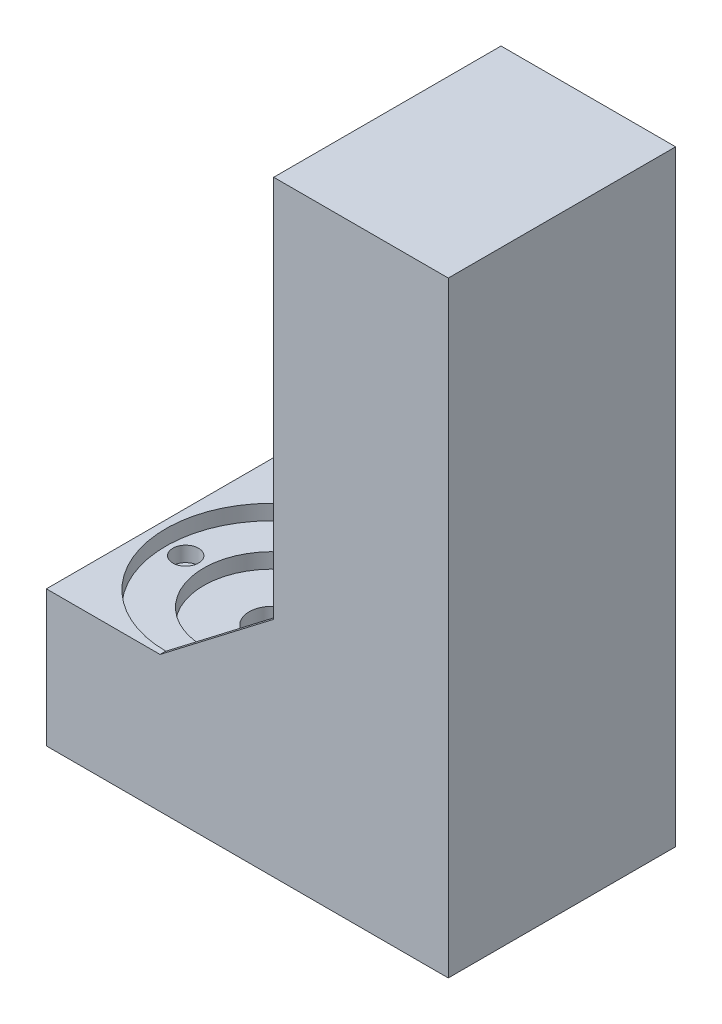
ISO-10303-21;
HEADER;
FILE_DESCRIPTION(('STEP AP214'),'2;1');
FILE_NAME('part.step','',(''),(''),'','','');
FILE_SCHEMA(('AUTOMOTIVE_DESIGN { 1 0 10303 214 1 1 1 1 }'));
ENDSEC;
DATA;
#1=APPLICATION_CONTEXT('core data for automotive mechanical design processes');
#2=APPLICATION_PROTOCOL_DEFINITION('international standard','automotive_design',2000,#1);
#3=PRODUCT_CONTEXT('',#1,'mechanical');
#4=PRODUCT('Part','Part','',(#3));
#5=PRODUCT_RELATED_PRODUCT_CATEGORY('part','',(#4));
#6=PRODUCT_DEFINITION_FORMATION('','',#4);
#7=PRODUCT_DEFINITION_CONTEXT('part definition',#1,'design');
#8=PRODUCT_DEFINITION('design','',#6,#7);
#9=PRODUCT_DEFINITION_SHAPE('','',#8);
#10=(LENGTH_UNIT() NAMED_UNIT(*) SI_UNIT(.MILLI.,.METRE.));
#11=(NAMED_UNIT(*) PLANE_ANGLE_UNIT() SI_UNIT($,.RADIAN.));
#12=(NAMED_UNIT(*) SI_UNIT($,.STERADIAN.) SOLID_ANGLE_UNIT());
#13=UNCERTAINTY_MEASURE_WITH_UNIT(LENGTH_MEASURE(1.E-05),#10,'distance_accuracy_value','');
#14=(GEOMETRIC_REPRESENTATION_CONTEXT(3) GLOBAL_UNCERTAINTY_ASSIGNED_CONTEXT((#13)) GLOBAL_UNIT_ASSIGNED_CONTEXT((#10,
#11,#12)) REPRESENTATION_CONTEXT('',''));
#15=CARTESIAN_POINT('',(0.,0.,0.));
#16=DIRECTION('',(0.,0.,1.));
#17=DIRECTION('',(1.,0.,0.));
#18=AXIS2_PLACEMENT_3D('',#15,#16,#17);
#19=CARTESIAN_POINT('',(30.,0.,30.));
#20=DIRECTION('',(-1.,0.,0.));
#21=DIRECTION('',(0.,0.,1.));
#22=AXIS2_PLACEMENT_3D('',#19,#20,#21);
#23=PLANE('',#22);
#24=CARTESIAN_POINT('',(30.,75.3392661580511,6.33968193765221));
#25=DIRECTION('',(-1.,0.,0.));
#26=DIRECTION('',(0.,0.,-1.));
#27=AXIS2_PLACEMENT_3D('',#24,#25,#26);
#28=CIRCLE('',#27,1.7);
#29=CARTESIAN_POINT('',(30.,75.3392661580511,8.03968193765221));
#30=VERTEX_POINT('',#29);
#31=CARTESIAN_POINT('',(30.,75.3392661580511,4.6396819376522));
#32=VERTEX_POINT('',#31);
#33=EDGE_CURVE('E225',#30,#32,#28,.T.);
#34=ORIENTED_EDGE('',*,*,#33,.F.);
#35=DIRECTION('',(0.,1.,0.));
#36=VECTOR('',#35,1.);
#37=CARTESIAN_POINT('',(30.,30.2097144125102,8.03968193765221));
#38=LINE('',#37,#36);
#39=CARTESIAN_POINT('',(30.,30.2097144125102,8.03968193765221));
#40=VERTEX_POINT('',#39);
#41=EDGE_CURVE('E212',#40,#30,#38,.T.);
#42=ORIENTED_EDGE('',*,*,#41,.F.);
#43=CARTESIAN_POINT('',(30.,30.2097144125102,6.33968193765221));
#44=DIRECTION('',(-1.,0.,0.));
#45=DIRECTION('',(0.,0.,1.));
#46=AXIS2_PLACEMENT_3D('',#43,#44,#45);
#47=CIRCLE('',#46,1.7);
#48=CARTESIAN_POINT('',(30.,30.2097144125102,4.63968193765221));
#49=VERTEX_POINT('',#48);
#50=EDGE_CURVE('E233',#49,#40,#47,.T.);
#51=ORIENTED_EDGE('',*,*,#50,.F.);
#52=DIRECTION('',(0.,-1.,0.));
#53=VECTOR('',#52,1.);
#54=CARTESIAN_POINT('',(30.,75.3392661580511,4.6396819376522));
#55=LINE('',#54,#53);
#56=EDGE_CURVE('E228',#32,#49,#55,.T.);
#57=ORIENTED_EDGE('',*,*,#56,.F.);
#58=EDGE_LOOP('',(#34,#42,#51,#57));
#59=FACE_BOUND('',#58,.T.);
#60=CARTESIAN_POINT('',(30.,75.3392661580511,23.4072386302814));
#61=DIRECTION('',(-1.,0.,0.));
#62=DIRECTION('',(0.,0.,1.));
#63=AXIS2_PLACEMENT_3D('',#60,#61,#62);
#64=CIRCLE('',#63,1.7);
#65=CARTESIAN_POINT('',(30.,75.3392661580511,25.1072386302814));
#66=VERTEX_POINT('',#65);
#67=CARTESIAN_POINT('',(30.,75.3392661580511,21.7072386302814));
#68=VERTEX_POINT('',#67);
#69=EDGE_CURVE('E229',#66,#68,#64,.T.);
#70=ORIENTED_EDGE('',*,*,#69,.F.);
#71=DIRECTION('',(0.,1.,0.));
#72=VECTOR('',#71,1.);
#73=CARTESIAN_POINT('',(30.,30.2097144125102,25.1072386302814));
#74=LINE('',#73,#72);
#75=CARTESIAN_POINT('',(30.,30.2097144125102,25.1072386302814));
#76=VERTEX_POINT('',#75);
#77=EDGE_CURVE('E266',#76,#66,#74,.T.);
#78=ORIENTED_EDGE('',*,*,#77,.F.);
#79=CARTESIAN_POINT('',(30.,30.2097144125102,23.4072386302814));
#80=DIRECTION('',(-1.,0.,0.));
#81=DIRECTION('',(0.,0.,1.));
#82=AXIS2_PLACEMENT_3D('',#79,#80,#81);
#83=CIRCLE('',#82,1.7);
#84=CARTESIAN_POINT('',(30.,30.2097144125102,21.7072386302814));
#85=VERTEX_POINT('',#84);
#86=EDGE_CURVE('E270',#85,#76,#83,.T.);
#87=ORIENTED_EDGE('',*,*,#86,.F.);
#88=DIRECTION('',(0.,-1.,0.));
#89=VECTOR('',#88,1.);
#90=CARTESIAN_POINT('',(30.,75.3392661580511,21.7072386302814));
#91=LINE('',#90,#89);
#92=EDGE_CURVE('E275',#68,#85,#91,.T.);
#93=ORIENTED_EDGE('',*,*,#92,.F.);
#94=EDGE_LOOP('',(#70,#78,#87,#93));
#95=FACE_BOUND('',#94,.T.);
#96=DIRECTION('',(0.,-1.,0.));
#97=VECTOR('',#96,1.);
#98=CARTESIAN_POINT('',(30.,0.,29.3));
#99=LINE('',#98,#97);
#100=CARTESIAN_POINT('',(30.,29.4758440432936,29.3));
#101=VERTEX_POINT('',#100);
#102=CARTESIAN_POINT('',(30.,17.96,29.3));
#103=VERTEX_POINT('',#102);
#104=EDGE_CURVE('E63',#101,#103,#99,.T.);
#105=ORIENTED_EDGE('',*,*,#104,.F.);
#106=DIRECTION('',(0.,0.,1.));
#107=VECTOR('',#106,1.);
#108=CARTESIAN_POINT('',(30.,29.4758440432936,29.3));
#109=LINE('',#108,#107);
#110=CARTESIAN_POINT('',(30.,29.4758440432936,30.));
#111=VERTEX_POINT('',#110);
#112=EDGE_CURVE('E68',#101,#111,#109,.T.);
#113=ORIENTED_EDGE('',*,*,#112,.T.);
#114=DIRECTION('',(0.,1.,0.));
#115=VECTOR('',#114,1.);
#116=CARTESIAN_POINT('',(30.,0.,30.));
#117=LINE('',#116,#115);
#118=CARTESIAN_POINT('',(30.,80.,30.));
#119=VERTEX_POINT('',#118);
#120=EDGE_CURVE('E362',#111,#119,#117,.T.);
#121=ORIENTED_EDGE('',*,*,#120,.T.);
#122=DIRECTION('',(0.,0.,-1.));
#123=VECTOR('',#122,1.);
#124=CARTESIAN_POINT('',(30.,80.,30.));
#125=LINE('',#124,#123);
#126=CARTESIAN_POINT('',(30.,80.,0.));
#127=VERTEX_POINT('',#126);
#128=EDGE_CURVE('E380',#119,#127,#125,.T.);
#129=ORIENTED_EDGE('',*,*,#128,.T.);
#130=DIRECTION('',(0.,1.,0.));
#131=VECTOR('',#130,1.);
#132=CARTESIAN_POINT('',(30.,0.,0.));
#133=LINE('',#132,#131);
#134=CARTESIAN_POINT('',(30.,29.4758440432936,0.));
#135=VERTEX_POINT('',#134);
#136=EDGE_CURVE('E356',#135,#127,#133,.T.);
#137=ORIENTED_EDGE('',*,*,#136,.F.);
#138=DIRECTION('',(0.,0.,-1.));
#139=VECTOR('',#138,1.);
#140=CARTESIAN_POINT('',(30.,29.4758440432936,0.999999999999997));
#141=LINE('',#140,#139);
#142=CARTESIAN_POINT('',(30.,29.4758440432936,0.999999999999997));
#143=VERTEX_POINT('',#142);
#144=EDGE_CURVE('E184',#143,#135,#141,.T.);
#145=ORIENTED_EDGE('',*,*,#144,.F.);
#146=DIRECTION('',(0.,-1.,0.));
#147=VECTOR('',#146,1.);
#148=CARTESIAN_POINT('',(30.,17.96,0.999999999999997));
#149=LINE('',#148,#147);
#150=CARTESIAN_POINT('',(30.,17.96,0.999999999999997));
#151=VERTEX_POINT('',#150);
#152=EDGE_CURVE('E185',#143,#151,#149,.T.);
#153=ORIENTED_EDGE('',*,*,#152,.T.);
#154=DIRECTION('',(0.,0.,-1.));
#155=VECTOR('',#154,1.);
#156=CARTESIAN_POINT('',(30.,17.96,30.));
#157=LINE('',#156,#155);
#158=EDGE_CURVE('E56',#103,#151,#157,.T.);
#159=ORIENTED_EDGE('',*,*,#158,.F.);
#160=EDGE_LOOP('',(#105,#113,#121,#129,#137,#145,#153,#159));
#161=FACE_BOUND('',#160,.T.);
#162=ADVANCED_FACE('F47',(#59,#95,#161),#23,.T.);
#163=CARTESIAN_POINT('',(0.,17.96,30.));
#164=DIRECTION('',(0.,1.,0.));
#165=DIRECTION('',(0.,0.,1.));
#166=AXIS2_PLACEMENT_3D('',#163,#164,#165);
#167=PLANE('',#166);
#168=CARTESIAN_POINT('',(15.,17.96,15.2403136032791));
#169=DIRECTION('',(0.,1.,0.));
#170=DIRECTION('',(0.,0.,1.));
#171=AXIS2_PLACEMENT_3D('',#168,#169,#170);
#172=CIRCLE('',#171,14.);
#173=CARTESIAN_POINT('',(15.,17.96,29.2403136032791));
#174=VERTEX_POINT('',#173);
#175=EDGE_CURVE('E315',#174,#174,#172,.T.);
#176=ORIENTED_EDGE('',*,*,#175,.F.);
#177=EDGE_LOOP('',(#176));
#178=FACE_BOUND('',#177,.T.);
#179=DIRECTION('',(1.,0.,0.));
#180=VECTOR('',#179,1.);
#181=CARTESIAN_POINT('',(0.,17.96,30.));
#182=LINE('',#181,#180);
#183=CARTESIAN_POINT('',(0.,17.96,30.));
#184=VERTEX_POINT('',#183);
#185=CARTESIAN_POINT('',(15.,17.96,30.));
#186=VERTEX_POINT('',#185);
#187=EDGE_CURVE('E390',#184,#186,#182,.T.);
#188=ORIENTED_EDGE('',*,*,#187,.T.);
#189=DIRECTION('',(0.,0.,1.));
#190=VECTOR('',#189,1.);
#191=CARTESIAN_POINT('',(15.,17.96,29.3));
#192=LINE('',#191,#190);
#193=CARTESIAN_POINT('',(15.,17.96,29.3));
#194=VERTEX_POINT('',#193);
#195=EDGE_CURVE('E433',#194,#186,#192,.T.);
#196=ORIENTED_EDGE('',*,*,#195,.F.);
#197=DIRECTION('',(-1.,0.,0.));
#198=VECTOR('',#197,1.);
#199=CARTESIAN_POINT('',(0.,17.96,29.3));
#200=LINE('',#199,#198);
#201=EDGE_CURVE('E11',#103,#194,#200,.T.);
#202=ORIENTED_EDGE('',*,*,#201,.F.);
#203=ORIENTED_EDGE('',*,*,#158,.T.);
#204=DIRECTION('',(-1.,0.,0.));
#205=VECTOR('',#204,1.);
#206=CARTESIAN_POINT('',(15.,17.96,0.999999999999997));
#207=LINE('',#206,#205);
#208=CARTESIAN_POINT('',(15.,17.96,0.999999999999997));
#209=VERTEX_POINT('',#208);
#210=EDGE_CURVE('E190',#151,#209,#207,.T.);
#211=ORIENTED_EDGE('',*,*,#210,.T.);
#212=DIRECTION('',(0.,0.,-1.));
#213=VECTOR('',#212,1.);
#214=CARTESIAN_POINT('',(15.,17.96,0.999999999999997));
#215=LINE('',#214,#213);
#216=CARTESIAN_POINT('',(15.,17.96,0.));
#217=VERTEX_POINT('',#216);
#218=EDGE_CURVE('E172',#209,#217,#215,.T.);
#219=ORIENTED_EDGE('',*,*,#218,.T.);
#220=DIRECTION('',(1.,0.,0.));
#221=VECTOR('',#220,1.);
#222=CARTESIAN_POINT('',(0.,17.96,0.));
#223=LINE('',#222,#221);
#224=CARTESIAN_POINT('',(0.,17.96,0.));
#225=VERTEX_POINT('',#224);
#226=EDGE_CURVE('E347',#225,#217,#223,.T.);
#227=ORIENTED_EDGE('',*,*,#226,.F.);
#228=DIRECTION('',(0.,0.,-1.));
#229=VECTOR('',#228,1.);
#230=CARTESIAN_POINT('',(0.,17.96,30.));
#231=LINE('',#230,#229);
#232=EDGE_CURVE('E371',#184,#225,#231,.T.);
#233=ORIENTED_EDGE('',*,*,#232,.F.);
#234=EDGE_LOOP('',(#188,#196,#202,#203,#211,#219,#227,#233));
#235=FACE_BOUND('',#234,.T.);
#236=ADVANCED_FACE('F49',(#178,#235),#167,.T.);
#237=CARTESIAN_POINT('',(30.,80.,30.));
#238=DIRECTION('',(0.,1.,0.));
#239=DIRECTION('',(0.,0.,1.));
#240=AXIS2_PLACEMENT_3D('',#237,#238,#239);
#241=PLANE('',#240);
#242=DIRECTION('',(1.,0.,0.));
#243=VECTOR('',#242,1.);
#244=CARTESIAN_POINT('',(30.,80.,0.));
#245=LINE('',#244,#243);
#246=CARTESIAN_POINT('',(53.04,80.,0.));
#247=VERTEX_POINT('',#246);
#248=EDGE_CURVE('E366',#127,#247,#245,.T.);
#249=ORIENTED_EDGE('',*,*,#248,.F.);
#250=ORIENTED_EDGE('',*,*,#128,.F.);
#251=DIRECTION('',(1.,0.,0.));
#252=VECTOR('',#251,1.);
#253=CARTESIAN_POINT('',(30.,80.,30.));
#254=LINE('',#253,#252);
#255=CARTESIAN_POINT('',(53.04,80.,30.));
#256=VERTEX_POINT('',#255);
#257=EDGE_CURVE('E351',#119,#256,#254,.T.);
#258=ORIENTED_EDGE('',*,*,#257,.T.);
#259=DIRECTION('',(0.,0.,-1.));
#260=VECTOR('',#259,1.);
#261=CARTESIAN_POINT('',(53.04,80.,30.));
#262=LINE('',#261,#260);
#263=EDGE_CURVE('E365',#256,#247,#262,.T.);
#264=ORIENTED_EDGE('',*,*,#263,.T.);
#265=EDGE_LOOP('',(#249,#250,#258,#264));
#266=FACE_BOUND('',#265,.T.);
#267=ADVANCED_FACE('F451',(#266),#241,.T.);
#268=CARTESIAN_POINT('',(30.,0.,30.));
#269=DIRECTION('',(0.,1.,0.));
#270=DIRECTION('',(0.,0.,1.));
#271=AXIS2_PLACEMENT_3D('',#268,#269,#270);
#272=PLANE('',#271);
#273=CARTESIAN_POINT('',(15.,0.,15.2403136032791));
#274=DIRECTION('',(0.,1.,0.));
#275=DIRECTION('',(0.,0.,1.));
#276=AXIS2_PLACEMENT_3D('',#273,#274,#275);
#277=CIRCLE('',#276,3.);
#278=CARTESIAN_POINT('',(15.,0.,18.2403136032791));
#279=VERTEX_POINT('',#278);
#280=EDGE_CURVE('E295',#279,#279,#277,.T.);
#281=ORIENTED_EDGE('',*,*,#280,.T.);
#282=EDGE_LOOP('',(#281));
#283=FACE_BOUND('',#282,.T.);
#284=DIRECTION('',(1.,0.,0.));
#285=VECTOR('',#284,1.);
#286=CARTESIAN_POINT('',(30.,0.,0.));
#287=LINE('',#286,#285);
#288=CARTESIAN_POINT('',(0.,0.,0.));
#289=VERTEX_POINT('',#288);
#290=CARTESIAN_POINT('',(53.04,0.,0.));
#291=VERTEX_POINT('',#290);
#292=EDGE_CURVE('E375',#289,#291,#287,.T.);
#293=ORIENTED_EDGE('',*,*,#292,.T.);
#294=DIRECTION('',(0.,0.,-1.));
#295=VECTOR('',#294,1.);
#296=CARTESIAN_POINT('',(53.04,0.,30.));
#297=LINE('',#296,#295);
#298=CARTESIAN_POINT('',(53.04,0.,30.));
#299=VERTEX_POINT('',#298);
#300=EDGE_CURVE('E384',#299,#291,#297,.T.);
#301=ORIENTED_EDGE('',*,*,#300,.F.);
#302=DIRECTION('',(1.,0.,0.));
#303=VECTOR('',#302,1.);
#304=CARTESIAN_POINT('',(30.,0.,30.));
#305=LINE('',#304,#303);
#306=CARTESIAN_POINT('',(0.,0.,30.));
#307=VERTEX_POINT('',#306);
#308=EDGE_CURVE('E359',#307,#299,#305,.T.);
#309=ORIENTED_EDGE('',*,*,#308,.F.);
#310=DIRECTION('',(0.,0.,-1.));
#311=VECTOR('',#310,1.);
#312=CARTESIAN_POINT('',(0.,0.,30.));
#313=LINE('',#312,#311);
#314=EDGE_CURVE('E398',#307,#289,#313,.T.);
#315=ORIENTED_EDGE('',*,*,#314,.T.);
#316=EDGE_LOOP('',(#293,#301,#309,#315));
#317=FACE_BOUND('',#316,.T.);
#318=ADVANCED_FACE('F412',(#283,#317),#272,.F.);
#319=CARTESIAN_POINT('',(53.04,0.,30.));
#320=DIRECTION('',(-1.,0.,0.));
#321=DIRECTION('',(0.,0.,1.));
#322=AXIS2_PLACEMENT_3D('',#319,#320,#321);
#323=PLANE('',#322);
#324=DIRECTION('',(0.,1.,0.));
#325=VECTOR('',#324,1.);
#326=CARTESIAN_POINT('',(53.04,0.,0.));
#327=LINE('',#326,#325);
#328=EDGE_CURVE('E370',#291,#247,#327,.T.);
#329=ORIENTED_EDGE('',*,*,#328,.T.);
#330=ORIENTED_EDGE('',*,*,#263,.F.);
#331=DIRECTION('',(0.,1.,0.));
#332=VECTOR('',#331,1.);
#333=CARTESIAN_POINT('',(53.04,0.,30.));
#334=LINE('',#333,#332);
#335=EDGE_CURVE('E355',#299,#256,#334,.T.);
#336=ORIENTED_EDGE('',*,*,#335,.F.);
#337=ORIENTED_EDGE('',*,*,#300,.T.);
#338=EDGE_LOOP('',(#329,#330,#336,#337));
#339=FACE_BOUND('',#338,.T.);
#340=ADVANCED_FACE('F423',(#339),#323,.F.);
#341=CARTESIAN_POINT('',(0.,0.,30.));
#342=DIRECTION('',(0.,0.,1.));
#343=DIRECTION('',(1.,0.,0.));
#344=AXIS2_PLACEMENT_3D('',#341,#342,#343);
#345=PLANE('',#344);
#346=ORIENTED_EDGE('',*,*,#120,.F.);
#347=DIRECTION('',(0.793201633051763,0.608959086740659,0.));
#348=VECTOR('',#347,1.);
#349=CARTESIAN_POINT('',(15.,17.96,30.));
#350=LINE('',#349,#348);
#351=EDGE_CURVE('E431',#186,#111,#350,.T.);
#352=ORIENTED_EDGE('',*,*,#351,.F.);
#353=ORIENTED_EDGE('',*,*,#187,.F.);
#354=DIRECTION('',(0.,1.,0.));
#355=VECTOR('',#354,1.);
#356=CARTESIAN_POINT('',(0.,0.,30.));
#357=LINE('',#356,#355);
#358=EDGE_CURVE('E393',#307,#184,#357,.T.);
#359=ORIENTED_EDGE('',*,*,#358,.F.);
#360=ORIENTED_EDGE('',*,*,#308,.T.);
#361=ORIENTED_EDGE('',*,*,#335,.T.);
#362=ORIENTED_EDGE('',*,*,#257,.F.);
#363=EDGE_LOOP('',(#346,#352,#353,#359,#360,#361,#362));
#364=FACE_BOUND('',#363,.T.);
#365=ADVANCED_FACE('F427',(#364),#345,.T.);
#366=CARTESIAN_POINT('',(0.,0.,0.));
#367=DIRECTION('',(0.,0.,1.));
#368=DIRECTION('',(1.,0.,0.));
#369=AXIS2_PLACEMENT_3D('',#366,#367,#368);
#370=PLANE('',#369);
#371=DIRECTION('',(0.793201633051763,0.608959086740659,0.));
#372=VECTOR('',#371,1.);
#373=CARTESIAN_POINT('',(15.,17.96,0.));
#374=LINE('',#373,#372);
#375=EDGE_CURVE('E178',#217,#135,#374,.T.);
#376=ORIENTED_EDGE('',*,*,#375,.T.);
#377=ORIENTED_EDGE('',*,*,#136,.T.);
#378=ORIENTED_EDGE('',*,*,#248,.T.);
#379=ORIENTED_EDGE('',*,*,#328,.F.);
#380=ORIENTED_EDGE('',*,*,#292,.F.);
#381=DIRECTION('',(0.,1.,0.));
#382=VECTOR('',#381,1.);
#383=CARTESIAN_POINT('',(0.,0.,0.));
#384=LINE('',#383,#382);
#385=EDGE_CURVE('E394',#289,#225,#384,.T.);
#386=ORIENTED_EDGE('',*,*,#385,.T.);
#387=ORIENTED_EDGE('',*,*,#226,.T.);
#388=EDGE_LOOP('',(#376,#377,#378,#379,#380,#386,#387));
#389=FACE_BOUND('',#388,.T.);
#390=ADVANCED_FACE('F418',(#389),#370,.F.);
#391=CARTESIAN_POINT('',(0.,0.,30.));
#392=DIRECTION('',(-1.,0.,0.));
#393=DIRECTION('',(0.,0.,1.));
#394=AXIS2_PLACEMENT_3D('',#391,#392,#393);
#395=PLANE('',#394);
#396=ORIENTED_EDGE('',*,*,#385,.F.);
#397=ORIENTED_EDGE('',*,*,#314,.F.);
#398=ORIENTED_EDGE('',*,*,#358,.T.);
#399=ORIENTED_EDGE('',*,*,#232,.T.);
#400=EDGE_LOOP('',(#396,#397,#398,#399));
#401=FACE_BOUND('',#400,.T.);
#402=ADVANCED_FACE('F416',(#401),#395,.T.);
#403=CARTESIAN_POINT('',(15.,15.96,15.2403136032791));
#404=DIRECTION('',(0.,1.,0.));
#405=DIRECTION('',(0.,0.,1.));
#406=AXIS2_PLACEMENT_3D('',#403,#404,#405);
#407=CYLINDRICAL_SURFACE('',#406,14.);
#408=CARTESIAN_POINT('',(15.,15.96,15.2403136032791));
#409=DIRECTION('',(0.,1.,0.));
#410=DIRECTION('',(0.,0.,1.));
#411=AXIS2_PLACEMENT_3D('',#408,#409,#410);
#412=CIRCLE('',#411,14.);
#413=CARTESIAN_POINT('',(15.,15.96,29.2403136032791));
#414=VERTEX_POINT('',#413);
#415=EDGE_CURVE('E343',#414,#414,#412,.T.);
#416=ORIENTED_EDGE('',*,*,#415,.F.);
#417=EDGE_LOOP('',(#416));
#418=FACE_BOUND('',#417,.T.);
#419=ORIENTED_EDGE('',*,*,#175,.T.);
#420=EDGE_LOOP('',(#419));
#421=FACE_BOUND('',#420,.T.);
#422=ADVANCED_FACE('F464',(#418,#421),#407,.F.);
#423=CARTESIAN_POINT('',(15.,15.96,15.2403136032791));
#424=DIRECTION('',(0.,1.,0.));
#425=DIRECTION('',(0.,0.,1.));
#426=AXIS2_PLACEMENT_3D('',#423,#424,#425);
#427=PLANE('',#426);
#428=CARTESIAN_POINT('',(15.,15.96,15.2403136032791));
#429=DIRECTION('',(0.,1.,0.));
#430=DIRECTION('',(0.,0.,1.));
#431=AXIS2_PLACEMENT_3D('',#428,#429,#430);
#432=CIRCLE('',#431,9.);
#433=CARTESIAN_POINT('',(15.,15.96,24.2403136032791));
#434=VERTEX_POINT('',#433);
#435=EDGE_CURVE('E299',#434,#434,#432,.T.);
#436=ORIENTED_EDGE('',*,*,#435,.F.);
#437=EDGE_LOOP('',(#436));
#438=FACE_BOUND('',#437,.T.);
#439=CARTESIAN_POINT('',(15.,15.96,3.4));
#440=DIRECTION('',(0.,1.,0.));
#441=DIRECTION('',(0.,0.,1.));
#442=AXIS2_PLACEMENT_3D('',#439,#440,#441);
#443=CIRCLE('',#442,1.7);
#444=CARTESIAN_POINT('',(15.,15.96,5.1));
#445=VERTEX_POINT('',#444);
#446=EDGE_CURVE('E316',#445,#445,#443,.T.);
#447=ORIENTED_EDGE('',*,*,#446,.F.);
#448=EDGE_LOOP('',(#447));
#449=FACE_BOUND('',#448,.T.);
#450=CARTESIAN_POINT('',(26.6,15.96,14.8989759006994));
#451=DIRECTION('',(0.,1.,0.));
#452=DIRECTION('',(0.,0.,1.));
#453=AXIS2_PLACEMENT_3D('',#450,#451,#452);
#454=CIRCLE('',#453,1.7);
#455=CARTESIAN_POINT('',(26.6,15.96,16.5989759006994));
#456=VERTEX_POINT('',#455);
#457=EDGE_CURVE('E320',#456,#456,#454,.T.);
#458=ORIENTED_EDGE('',*,*,#457,.F.);
#459=EDGE_LOOP('',(#458));
#460=FACE_BOUND('',#459,.T.);
#461=CARTESIAN_POINT('',(14.9972778463983,15.96,26.6));
#462=DIRECTION('',(0.,1.,0.));
#463=DIRECTION('',(0.,0.,1.));
#464=AXIS2_PLACEMENT_3D('',#461,#462,#463);
#465=CIRCLE('',#464,1.7);
#466=CARTESIAN_POINT('',(14.9972778463983,15.96,28.3));
#467=VERTEX_POINT('',#466);
#468=EDGE_CURVE('E328',#467,#467,#465,.T.);
#469=ORIENTED_EDGE('',*,*,#468,.F.);
#470=EDGE_LOOP('',(#469));
#471=FACE_BOUND('',#470,.T.);
#472=CARTESIAN_POINT('',(3.4,15.96,15.0181957995578));
#473=DIRECTION('',(0.,1.,0.));
#474=DIRECTION('',(0.,0.,1.));
#475=AXIS2_PLACEMENT_3D('',#472,#473,#474);
#476=CIRCLE('',#475,1.7);
#477=CARTESIAN_POINT('',(3.4,15.96,16.7181957995578));
#478=VERTEX_POINT('',#477);
#479=EDGE_CURVE('E336',#478,#478,#476,.T.);
#480=ORIENTED_EDGE('',*,*,#479,.F.);
#481=EDGE_LOOP('',(#480));
#482=FACE_BOUND('',#481,.T.);
#483=ORIENTED_EDGE('',*,*,#415,.T.);
#484=EDGE_LOOP('',(#483));
#485=FACE_BOUND('',#484,.T.);
#486=ADVANCED_FACE('F485',(#438,#449,#460,#471,#482,#485),#427,.T.);
#487=CARTESIAN_POINT('',(3.4,13.96,15.0181957995578));
#488=DIRECTION('',(0.,1.,0.));
#489=DIRECTION('',(0.,0.,1.));
#490=AXIS2_PLACEMENT_3D('',#487,#488,#489);
#491=CYLINDRICAL_SURFACE('',#490,1.7);
#492=CARTESIAN_POINT('',(3.4,13.96,15.0181957995578));
#493=DIRECTION('',(0.,1.,0.));
#494=DIRECTION('',(0.,0.,1.));
#495=AXIS2_PLACEMENT_3D('',#492,#493,#494);
#496=CIRCLE('',#495,1.7);
#497=CARTESIAN_POINT('',(3.4,13.96,16.7181957995578));
#498=VERTEX_POINT('',#497);
#499=EDGE_CURVE('E307',#498,#498,#496,.T.);
#500=ORIENTED_EDGE('',*,*,#499,.F.);
#501=EDGE_LOOP('',(#500));
#502=FACE_BOUND('',#501,.T.);
#503=ORIENTED_EDGE('',*,*,#479,.T.);
#504=EDGE_LOOP('',(#503));
#505=FACE_BOUND('',#504,.T.);
#506=ADVANCED_FACE('F489',(#502,#505),#491,.F.);
#507=CARTESIAN_POINT('',(3.4,13.96,15.0181957995578));
#508=DIRECTION('',(0.,1.,0.));
#509=DIRECTION('',(0.,0.,1.));
#510=AXIS2_PLACEMENT_3D('',#507,#508,#509);
#511=PLANE('',#510);
#512=ORIENTED_EDGE('',*,*,#499,.T.);
#513=EDGE_LOOP('',(#512));
#514=FACE_BOUND('',#513,.T.);
#515=ADVANCED_FACE('F491',(#514),#511,.T.);
#516=CARTESIAN_POINT('',(14.9972778463983,13.96,26.6));
#517=DIRECTION('',(0.,1.,0.));
#518=DIRECTION('',(0.,0.,1.));
#519=AXIS2_PLACEMENT_3D('',#516,#517,#518);
#520=CYLINDRICAL_SURFACE('',#519,1.7);
#521=CARTESIAN_POINT('',(14.9972778463983,13.96,26.6));
#522=DIRECTION('',(0.,1.,0.));
#523=DIRECTION('',(0.,0.,1.));
#524=AXIS2_PLACEMENT_3D('',#521,#522,#523);
#525=CIRCLE('',#524,1.7);
#526=CARTESIAN_POINT('',(14.9972778463983,13.96,28.3));
#527=VERTEX_POINT('',#526);
#528=EDGE_CURVE('E332',#527,#527,#525,.T.);
#529=ORIENTED_EDGE('',*,*,#528,.F.);
#530=EDGE_LOOP('',(#529));
#531=FACE_BOUND('',#530,.T.);
#532=ORIENTED_EDGE('',*,*,#468,.T.);
#533=EDGE_LOOP('',(#532));
#534=FACE_BOUND('',#533,.T.);
#535=ADVANCED_FACE('F494',(#531,#534),#520,.F.);
#536=CARTESIAN_POINT('',(14.9972778463983,13.96,26.6));
#537=DIRECTION('',(0.,1.,0.));
#538=DIRECTION('',(0.,0.,1.));
#539=AXIS2_PLACEMENT_3D('',#536,#537,#538);
#540=PLANE('',#539);
#541=ORIENTED_EDGE('',*,*,#528,.T.);
#542=EDGE_LOOP('',(#541));
#543=FACE_BOUND('',#542,.T.);
#544=ADVANCED_FACE('F499',(#543),#540,.T.);
#545=CARTESIAN_POINT('',(26.6,13.96,14.8989759006994));
#546=DIRECTION('',(0.,1.,0.));
#547=DIRECTION('',(0.,0.,1.));
#548=AXIS2_PLACEMENT_3D('',#545,#546,#547);
#549=CYLINDRICAL_SURFACE('',#548,1.7);
#550=CARTESIAN_POINT('',(26.6,13.96,14.8989759006994));
#551=DIRECTION('',(0.,1.,0.));
#552=DIRECTION('',(0.,0.,1.));
#553=AXIS2_PLACEMENT_3D('',#550,#551,#552);
#554=CIRCLE('',#553,1.7);
#555=CARTESIAN_POINT('',(26.6,13.96,16.5989759006994));
#556=VERTEX_POINT('',#555);
#557=EDGE_CURVE('E324',#556,#556,#554,.T.);
#558=ORIENTED_EDGE('',*,*,#557,.F.);
#559=EDGE_LOOP('',(#558));
#560=FACE_BOUND('',#559,.T.);
#561=ORIENTED_EDGE('',*,*,#457,.T.);
#562=EDGE_LOOP('',(#561));
#563=FACE_BOUND('',#562,.T.);
#564=ADVANCED_FACE('F502',(#560,#563),#549,.F.);
#565=CARTESIAN_POINT('',(26.6,13.96,14.8989759006994));
#566=DIRECTION('',(0.,1.,0.));
#567=DIRECTION('',(0.,0.,1.));
#568=AXIS2_PLACEMENT_3D('',#565,#566,#567);
#569=PLANE('',#568);
#570=ORIENTED_EDGE('',*,*,#557,.T.);
#571=EDGE_LOOP('',(#570));
#572=FACE_BOUND('',#571,.T.);
#573=ADVANCED_FACE('F507',(#572),#569,.T.);
#574=CARTESIAN_POINT('',(15.,13.96,3.4));
#575=DIRECTION('',(0.,1.,0.));
#576=DIRECTION('',(0.,0.,1.));
#577=AXIS2_PLACEMENT_3D('',#574,#575,#576);
#578=CYLINDRICAL_SURFACE('',#577,1.7);
#579=CARTESIAN_POINT('',(15.,13.96,3.4));
#580=DIRECTION('',(0.,1.,0.));
#581=DIRECTION('',(0.,0.,1.));
#582=AXIS2_PLACEMENT_3D('',#579,#580,#581);
#583=CIRCLE('',#582,1.7);
#584=CARTESIAN_POINT('',(15.,13.96,5.1));
#585=VERTEX_POINT('',#584);
#586=EDGE_CURVE('E311',#585,#585,#583,.T.);
#587=ORIENTED_EDGE('',*,*,#586,.F.);
#588=EDGE_LOOP('',(#587));
#589=FACE_BOUND('',#588,.T.);
#590=ORIENTED_EDGE('',*,*,#446,.T.);
#591=EDGE_LOOP('',(#590));
#592=FACE_BOUND('',#591,.T.);
#593=ADVANCED_FACE('F510',(#589,#592),#578,.F.);
#594=CARTESIAN_POINT('',(15.,13.96,3.4));
#595=DIRECTION('',(0.,1.,0.));
#596=DIRECTION('',(0.,0.,1.));
#597=AXIS2_PLACEMENT_3D('',#594,#595,#596);
#598=PLANE('',#597);
#599=ORIENTED_EDGE('',*,*,#586,.T.);
#600=EDGE_LOOP('',(#599));
#601=FACE_BOUND('',#600,.T.);
#602=ADVANCED_FACE('F517',(#601),#598,.T.);
#603=CARTESIAN_POINT('',(15.,13.96,15.2403136032791));
#604=DIRECTION('',(0.,1.,0.));
#605=DIRECTION('',(0.,0.,1.));
#606=AXIS2_PLACEMENT_3D('',#603,#604,#605);
#607=CYLINDRICAL_SURFACE('',#606,9.);
#608=CARTESIAN_POINT('',(15.,13.96,15.2403136032791));
#609=DIRECTION('',(0.,1.,0.));
#610=DIRECTION('',(0.,0.,1.));
#611=AXIS2_PLACEMENT_3D('',#608,#609,#610);
#612=CIRCLE('',#611,9.);
#613=CARTESIAN_POINT('',(15.,13.96,24.2403136032791));
#614=VERTEX_POINT('',#613);
#615=EDGE_CURVE('E303',#614,#614,#612,.T.);
#616=ORIENTED_EDGE('',*,*,#615,.F.);
#617=EDGE_LOOP('',(#616));
#618=FACE_BOUND('',#617,.T.);
#619=ORIENTED_EDGE('',*,*,#435,.T.);
#620=EDGE_LOOP('',(#619));
#621=FACE_BOUND('',#620,.T.);
#622=ADVANCED_FACE('F521',(#618,#621),#607,.F.);
#623=CARTESIAN_POINT('',(15.,13.96,15.2403136032791));
#624=DIRECTION('',(0.,1.,0.));
#625=DIRECTION('',(0.,0.,1.));
#626=AXIS2_PLACEMENT_3D('',#623,#624,#625);
#627=PLANE('',#626);
#628=CARTESIAN_POINT('',(15.,13.96,15.2403136032791));
#629=DIRECTION('',(0.,1.,0.));
#630=DIRECTION('',(0.,0.,1.));
#631=AXIS2_PLACEMENT_3D('',#628,#629,#630);
#632=CIRCLE('',#631,3.);
#633=CARTESIAN_POINT('',(15.,13.96,18.2403136032791));
#634=VERTEX_POINT('',#633);
#635=EDGE_CURVE('E243',#634,#634,#632,.T.);
#636=ORIENTED_EDGE('',*,*,#635,.F.);
#637=EDGE_LOOP('',(#636));
#638=FACE_BOUND('',#637,.T.);
#639=ORIENTED_EDGE('',*,*,#615,.T.);
#640=EDGE_LOOP('',(#639));
#641=FACE_BOUND('',#640,.T.);
#642=ADVANCED_FACE('F525',(#638,#641),#627,.T.);
#643=CARTESIAN_POINT('',(15.,0.,15.2403136032791));
#644=DIRECTION('',(0.,1.,0.));
#645=DIRECTION('',(0.,0.,1.));
#646=AXIS2_PLACEMENT_3D('',#643,#644,#645);
#647=CYLINDRICAL_SURFACE('',#646,3.);
#648=ORIENTED_EDGE('',*,*,#280,.F.);
#649=EDGE_LOOP('',(#648));
#650=FACE_BOUND('',#649,.T.);
#651=ORIENTED_EDGE('',*,*,#635,.T.);
#652=EDGE_LOOP('',(#651));
#653=FACE_BOUND('',#652,.T.);
#654=ADVANCED_FACE('F529',(#650,#653),#647,.F.);
#655=CARTESIAN_POINT('',(32.,75.3392661580511,23.4072386302814));
#656=DIRECTION('',(-1.,0.,0.));
#657=DIRECTION('',(0.,0.,1.));
#658=AXIS2_PLACEMENT_3D('',#655,#656,#657);
#659=CYLINDRICAL_SURFACE('',#658,1.7);
#660=ORIENTED_EDGE('',*,*,#69,.T.);
#661=DIRECTION('',(-1.,0.,0.));
#662=VECTOR('',#661,1.);
#663=CARTESIAN_POINT('',(32.,75.3392661580511,21.7072386302814));
#664=LINE('',#663,#662);
#665=CARTESIAN_POINT('',(32.,75.3392661580511,21.7072386302814));
#666=VERTEX_POINT('',#665);
#667=EDGE_CURVE('E253',#666,#68,#664,.T.);
#668=ORIENTED_EDGE('',*,*,#667,.F.);
#669=CARTESIAN_POINT('',(32.,75.3392661580511,23.4072386302814));
#670=DIRECTION('',(-1.,0.,0.));
#671=DIRECTION('',(0.,0.,1.));
#672=AXIS2_PLACEMENT_3D('',#669,#670,#671);
#673=CIRCLE('',#672,1.7);
#674=CARTESIAN_POINT('',(32.,75.3392661580511,25.1072386302814));
#675=VERTEX_POINT('',#674);
#676=EDGE_CURVE('E271',#675,#666,#673,.T.);
#677=ORIENTED_EDGE('',*,*,#676,.F.);
#678=DIRECTION('',(-1.,0.,0.));
#679=VECTOR('',#678,1.);
#680=CARTESIAN_POINT('',(32.,75.3392661580511,25.1072386302814));
#681=LINE('',#680,#679);
#682=EDGE_CURVE('E205',#675,#66,#681,.T.);
#683=ORIENTED_EDGE('',*,*,#682,.T.);
#684=EDGE_LOOP('',(#660,#668,#677,#683));
#685=FACE_BOUND('',#684,.T.);
#686=ADVANCED_FACE('F533',(#685),#659,.F.);
#687=CARTESIAN_POINT('',(32.,30.2097144125102,25.1072386302814));
#688=DIRECTION('',(0.,0.,1.));
#689=DIRECTION('',(1.,0.,0.));
#690=AXIS2_PLACEMENT_3D('',#687,#688,#689);
#691=PLANE('',#690);
#692=ORIENTED_EDGE('',*,*,#77,.T.);
#693=ORIENTED_EDGE('',*,*,#682,.F.);
#694=DIRECTION('',(0.,1.,0.));
#695=VECTOR('',#694,1.);
#696=CARTESIAN_POINT('',(32.,30.2097144125102,25.1072386302814));
#697=LINE('',#696,#695);
#698=CARTESIAN_POINT('',(32.,30.2097144125102,25.1072386302814));
#699=VERTEX_POINT('',#698);
#700=EDGE_CURVE('E257',#699,#675,#697,.T.);
#701=ORIENTED_EDGE('',*,*,#700,.F.);
#702=DIRECTION('',(-1.,0.,0.));
#703=VECTOR('',#702,1.);
#704=CARTESIAN_POINT('',(32.,30.2097144125102,25.1072386302814));
#705=LINE('',#704,#703);
#706=EDGE_CURVE('E261',#699,#76,#705,.T.);
#707=ORIENTED_EDGE('',*,*,#706,.T.);
#708=EDGE_LOOP('',(#692,#693,#701,#707));
#709=FACE_BOUND('',#708,.T.);
#710=ADVANCED_FACE('F541',(#709),#691,.F.);
#711=CARTESIAN_POINT('',(32.,30.2097144125102,23.4072386302814));
#712=DIRECTION('',(-1.,0.,0.));
#713=DIRECTION('',(0.,0.,1.));
#714=AXIS2_PLACEMENT_3D('',#711,#712,#713);
#715=CYLINDRICAL_SURFACE('',#714,1.7);
#716=ORIENTED_EDGE('',*,*,#86,.T.);
#717=ORIENTED_EDGE('',*,*,#706,.F.);
#718=CARTESIAN_POINT('',(32.,30.2097144125102,23.4072386302814));
#719=DIRECTION('',(-1.,0.,0.));
#720=DIRECTION('',(0.,0.,1.));
#721=AXIS2_PLACEMENT_3D('',#718,#719,#720);
#722=CIRCLE('',#721,1.7);
#723=CARTESIAN_POINT('',(32.,30.2097144125102,21.7072386302814));
#724=VERTEX_POINT('',#723);
#725=EDGE_CURVE('E284',#724,#699,#722,.T.);
#726=ORIENTED_EDGE('',*,*,#725,.F.);
#727=DIRECTION('',(-1.,0.,0.));
#728=VECTOR('',#727,1.);
#729=CARTESIAN_POINT('',(32.,30.2097144125102,21.7072386302814));
#730=LINE('',#729,#728);
#731=EDGE_CURVE('E258',#724,#85,#730,.T.);
#732=ORIENTED_EDGE('',*,*,#731,.T.);
#733=EDGE_LOOP('',(#716,#717,#726,#732));
#734=FACE_BOUND('',#733,.T.);
#735=ADVANCED_FACE('F544',(#734),#715,.F.);
#736=CARTESIAN_POINT('',(32.,75.3392661580511,21.7072386302814));
#737=DIRECTION('',(0.,0.,-1.));
#738=DIRECTION('',(-1.,0.,0.));
#739=AXIS2_PLACEMENT_3D('',#736,#737,#738);
#740=PLANE('',#739);
#741=ORIENTED_EDGE('',*,*,#92,.T.);
#742=ORIENTED_EDGE('',*,*,#731,.F.);
#743=DIRECTION('',(0.,-1.,0.));
#744=VECTOR('',#743,1.);
#745=CARTESIAN_POINT('',(32.,75.3392661580511,21.7072386302814));
#746=LINE('',#745,#744);
#747=EDGE_CURVE('E288',#666,#724,#746,.T.);
#748=ORIENTED_EDGE('',*,*,#747,.F.);
#749=ORIENTED_EDGE('',*,*,#667,.T.);
#750=EDGE_LOOP('',(#741,#742,#748,#749));
#751=FACE_BOUND('',#750,.T.);
#752=ADVANCED_FACE('F539',(#751),#740,.F.);
#753=CARTESIAN_POINT('',(32.,75.3392661580511,23.4072386302814));
#754=DIRECTION('',(-1.,0.,0.));
#755=DIRECTION('',(0.,0.,1.));
#756=AXIS2_PLACEMENT_3D('',#753,#754,#755);
#757=PLANE('',#756);
#758=ORIENTED_EDGE('',*,*,#676,.T.);
#759=ORIENTED_EDGE('',*,*,#747,.T.);
#760=ORIENTED_EDGE('',*,*,#725,.T.);
#761=ORIENTED_EDGE('',*,*,#700,.T.);
#762=EDGE_LOOP('',(#758,#759,#760,#761));
#763=FACE_BOUND('',#762,.T.);
#764=ADVANCED_FACE('F535',(#763),#757,.T.);
#765=CARTESIAN_POINT('',(32.,75.3392661580511,6.33968193765221));
#766=DIRECTION('',(-1.,0.,0.));
#767=DIRECTION('',(0.,0.,1.));
#768=AXIS2_PLACEMENT_3D('',#765,#766,#767);
#769=CYLINDRICAL_SURFACE('',#768,1.7);
#770=ORIENTED_EDGE('',*,*,#33,.T.);
#771=DIRECTION('',(-1.,0.,0.));
#772=VECTOR('',#771,1.);
#773=CARTESIAN_POINT('',(32.,75.3392661580511,4.6396819376522));
#774=LINE('',#773,#772);
#775=CARTESIAN_POINT('',(32.,75.3392661580511,4.6396819376522));
#776=VERTEX_POINT('',#775);
#777=EDGE_CURVE('E224',#776,#32,#774,.T.);
#778=ORIENTED_EDGE('',*,*,#777,.F.);
#779=CARTESIAN_POINT('',(32.,75.3392661580511,6.33968193765221));
#780=DIRECTION('',(-1.,0.,0.));
#781=DIRECTION('',(0.,0.,-1.));
#782=AXIS2_PLACEMENT_3D('',#779,#780,#781);
#783=CIRCLE('',#782,1.7);
#784=CARTESIAN_POINT('',(32.,75.3392661580511,8.03968193765221));
#785=VERTEX_POINT('',#784);
#786=EDGE_CURVE('E207',#785,#776,#783,.T.);
#787=ORIENTED_EDGE('',*,*,#786,.F.);
#788=DIRECTION('',(-1.,0.,0.));
#789=VECTOR('',#788,1.);
#790=CARTESIAN_POINT('',(32.,75.3392661580511,8.03968193765221));
#791=LINE('',#790,#789);
#792=EDGE_CURVE('E240',#785,#30,#791,.T.);
#793=ORIENTED_EDGE('',*,*,#792,.T.);
#794=EDGE_LOOP('',(#770,#778,#787,#793));
#795=FACE_BOUND('',#794,.T.);
#796=ADVANCED_FACE('F538',(#795),#769,.F.);
#797=CARTESIAN_POINT('',(32.,30.2097144125102,8.03968193765221));
#798=DIRECTION('',(0.,0.,1.));
#799=DIRECTION('',(0.,-1.,0.));
#800=AXIS2_PLACEMENT_3D('',#797,#798,#799);
#801=PLANE('',#800);
#802=ORIENTED_EDGE('',*,*,#41,.T.);
#803=ORIENTED_EDGE('',*,*,#792,.F.);
#804=DIRECTION('',(0.,1.,0.));
#805=VECTOR('',#804,1.);
#806=CARTESIAN_POINT('',(32.,30.2097144125102,8.03968193765221));
#807=LINE('',#806,#805);
#808=CARTESIAN_POINT('',(32.,30.2097144125102,8.03968193765221));
#809=VERTEX_POINT('',#808);
#810=EDGE_CURVE('E220',#809,#785,#807,.T.);
#811=ORIENTED_EDGE('',*,*,#810,.F.);
#812=DIRECTION('',(-1.,0.,0.));
#813=VECTOR('',#812,1.);
#814=CARTESIAN_POINT('',(32.,30.2097144125102,8.03968193765221));
#815=LINE('',#814,#813);
#816=EDGE_CURVE('E244',#809,#40,#815,.T.);
#817=ORIENTED_EDGE('',*,*,#816,.T.);
#818=EDGE_LOOP('',(#802,#803,#811,#817));
#819=FACE_BOUND('',#818,.T.);
#820=ADVANCED_FACE('F557',(#819),#801,.F.);
#821=CARTESIAN_POINT('',(32.,30.2097144125102,6.33968193765221));
#822=DIRECTION('',(-1.,0.,0.));
#823=DIRECTION('',(0.,0.,1.));
#824=AXIS2_PLACEMENT_3D('',#821,#822,#823);
#825=CYLINDRICAL_SURFACE('',#824,1.7);
#826=ORIENTED_EDGE('',*,*,#50,.T.);
#827=ORIENTED_EDGE('',*,*,#816,.F.);
#828=CARTESIAN_POINT('',(32.,30.2097144125102,6.33968193765221));
#829=DIRECTION('',(-1.,0.,0.));
#830=DIRECTION('',(0.,0.,1.));
#831=AXIS2_PLACEMENT_3D('',#828,#829,#830);
#832=CIRCLE('',#831,1.7);
#833=CARTESIAN_POINT('',(32.,30.2097144125102,4.63968193765221));
#834=VERTEX_POINT('',#833);
#835=EDGE_CURVE('E216',#834,#809,#832,.T.);
#836=ORIENTED_EDGE('',*,*,#835,.F.);
#837=DIRECTION('',(-1.,0.,0.));
#838=VECTOR('',#837,1.);
#839=CARTESIAN_POINT('',(32.,30.2097144125102,4.63968193765221));
#840=LINE('',#839,#838);
#841=EDGE_CURVE('E247',#834,#49,#840,.T.);
#842=ORIENTED_EDGE('',*,*,#841,.T.);
#843=EDGE_LOOP('',(#826,#827,#836,#842));
#844=FACE_BOUND('',#843,.T.);
#845=ADVANCED_FACE('F563',(#844),#825,.F.);
#846=CARTESIAN_POINT('',(32.,75.3392661580511,4.6396819376522));
#847=DIRECTION('',(0.,0.,-1.));
#848=DIRECTION('',(0.,1.,0.));
#849=AXIS2_PLACEMENT_3D('',#846,#847,#848);
#850=PLANE('',#849);
#851=ORIENTED_EDGE('',*,*,#56,.T.);
#852=ORIENTED_EDGE('',*,*,#841,.F.);
#853=DIRECTION('',(0.,-1.,0.));
#854=VECTOR('',#853,1.);
#855=CARTESIAN_POINT('',(32.,75.3392661580511,4.6396819376522));
#856=LINE('',#855,#854);
#857=EDGE_CURVE('E211',#776,#834,#856,.T.);
#858=ORIENTED_EDGE('',*,*,#857,.F.);
#859=ORIENTED_EDGE('',*,*,#777,.T.);
#860=EDGE_LOOP('',(#851,#852,#858,#859));
#861=FACE_BOUND('',#860,.T.);
#862=ADVANCED_FACE('F559',(#861),#850,.F.);
#863=CARTESIAN_POINT('',(32.,75.3392661580511,6.33968193765221));
#864=DIRECTION('',(1.,0.,0.));
#865=DIRECTION('',(0.,0.,-1.));
#866=AXIS2_PLACEMENT_3D('',#863,#864,#865);
#867=PLANE('',#866);
#868=ORIENTED_EDGE('',*,*,#786,.T.);
#869=ORIENTED_EDGE('',*,*,#857,.T.);
#870=ORIENTED_EDGE('',*,*,#835,.T.);
#871=ORIENTED_EDGE('',*,*,#810,.T.);
#872=EDGE_LOOP('',(#868,#869,#870,#871));
#873=FACE_BOUND('',#872,.T.);
#874=ADVANCED_FACE('F562',(#873),#867,.F.);
#875=CARTESIAN_POINT('',(15.,17.96,0.999999999999997));
#876=DIRECTION('',(-0.608959086740659,0.793201633051763,0.));
#877=DIRECTION('',(-0.793201633051763,-0.608959086740659,0.));
#878=AXIS2_PLACEMENT_3D('',#875,#876,#877);
#879=PLANE('',#878);
#880=ORIENTED_EDGE('',*,*,#375,.F.);
#881=ORIENTED_EDGE('',*,*,#218,.F.);
#882=DIRECTION('',(0.793201633051763,0.608959086740659,0.));
#883=VECTOR('',#882,1.);
#884=CARTESIAN_POINT('',(15.,17.96,0.999999999999997));
#885=LINE('',#884,#883);
#886=EDGE_CURVE('E175',#209,#143,#885,.T.);
#887=ORIENTED_EDGE('',*,*,#886,.T.);
#888=ORIENTED_EDGE('',*,*,#144,.T.);
#889=EDGE_LOOP('',(#880,#881,#887,#888));
#890=FACE_BOUND('',#889,.T.);
#891=ADVANCED_FACE('F174',(#890),#879,.T.);
#892=CARTESIAN_POINT('',(0.,0.,0.999999999999997));
#893=DIRECTION('',(0.,0.,1.));
#894=DIRECTION('',(1.,0.,0.));
#895=AXIS2_PLACEMENT_3D('',#892,#893,#894);
#896=PLANE('',#895);
#897=ORIENTED_EDGE('',*,*,#210,.F.);
#898=ORIENTED_EDGE('',*,*,#152,.F.);
#899=ORIENTED_EDGE('',*,*,#886,.F.);
#900=EDGE_LOOP('',(#897,#898,#899));
#901=FACE_BOUND('',#900,.T.);
#902=ADVANCED_FACE('F189',(#901),#896,.T.);
#903=CARTESIAN_POINT('',(15.,17.96,29.3));
#904=DIRECTION('',(0.608959086740659,-0.793201633051763,0.));
#905=DIRECTION('',(0.793201633051763,0.608959086740659,0.));
#906=AXIS2_PLACEMENT_3D('',#903,#904,#905);
#907=PLANE('',#906);
#908=ORIENTED_EDGE('',*,*,#351,.T.);
#909=ORIENTED_EDGE('',*,*,#112,.F.);
#910=DIRECTION('',(0.793201633051763,0.608959086740659,0.));
#911=VECTOR('',#910,1.);
#912=CARTESIAN_POINT('',(15.,17.96,29.3));
#913=LINE('',#912,#911);
#914=EDGE_CURVE('E437',#194,#101,#913,.T.);
#915=ORIENTED_EDGE('',*,*,#914,.F.);
#916=ORIENTED_EDGE('',*,*,#195,.T.);
#917=EDGE_LOOP('',(#908,#909,#915,#916));
#918=FACE_BOUND('',#917,.T.);
#919=ADVANCED_FACE('F436',(#918),#907,.F.);
#920=CARTESIAN_POINT('',(0.,0.,29.3));
#921=DIRECTION('',(0.,0.,-1.));
#922=DIRECTION('',(-1.,0.,0.));
#923=AXIS2_PLACEMENT_3D('',#920,#921,#922);
#924=PLANE('',#923);
#925=ORIENTED_EDGE('',*,*,#914,.T.);
#926=ORIENTED_EDGE('',*,*,#104,.T.);
#927=ORIENTED_EDGE('',*,*,#201,.T.);
#928=EDGE_LOOP('',(#925,#926,#927));
#929=FACE_BOUND('',#928,.T.);
#930=ADVANCED_FACE('F447',(#929),#924,.T.);
#931=CLOSED_SHELL('',(#162,#236,#267,#318,#340,#365,#390,#402,#422,#486,#506,#515,#535,#544,
#564,#573,#593,#602,#622,#642,#654,#686,#710,#735,#752,#764,#796,#820,#845,#862,#874,#891,#902,
#919,#930));
#932=MANIFOLD_SOLID_BREP('B2',#931);
#933=ADVANCED_BREP_SHAPE_REPRESENTATION('',(#18,#932),#14);
#934=SHAPE_DEFINITION_REPRESENTATION(#9,#933);
ENDSEC;
END-ISO-10303-21;
